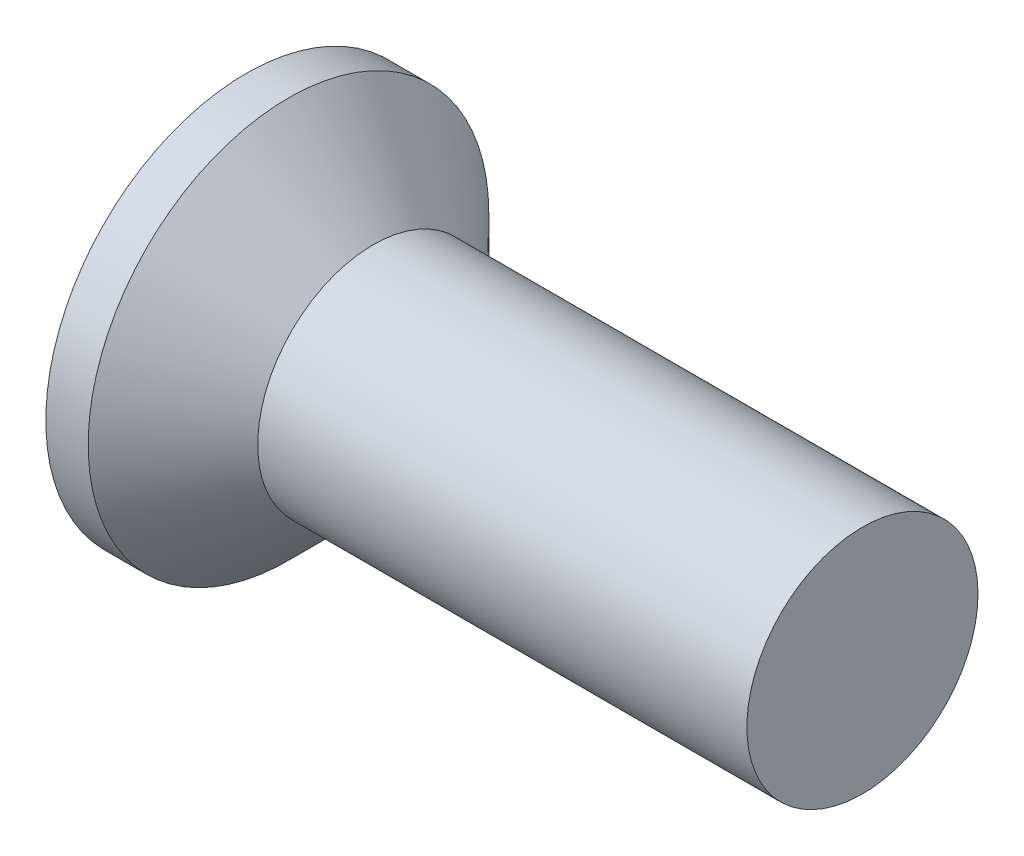
ISO-10303-21;
HEADER;
FILE_DESCRIPTION(('STEP AP214'),'2;1');
FILE_NAME('part.step','',(''),(''),'','','');
FILE_SCHEMA(('AUTOMOTIVE_DESIGN { 1 0 10303 214 1 1 1 1 }'));
ENDSEC;
DATA;
#1=APPLICATION_CONTEXT('core data for automotive mechanical design processes');
#2=APPLICATION_PROTOCOL_DEFINITION('international standard','automotive_design',2000,#1);
#3=PRODUCT_CONTEXT('',#1,'mechanical');
#4=PRODUCT('Part','Part','',(#3));
#5=PRODUCT_RELATED_PRODUCT_CATEGORY('part','',(#4));
#6=PRODUCT_DEFINITION_FORMATION('','',#4);
#7=PRODUCT_DEFINITION_CONTEXT('part definition',#1,'design');
#8=PRODUCT_DEFINITION('design','',#6,#7);
#9=PRODUCT_DEFINITION_SHAPE('','',#8);
#10=(LENGTH_UNIT() NAMED_UNIT(*) SI_UNIT(.MILLI.,.METRE.));
#11=(NAMED_UNIT(*) PLANE_ANGLE_UNIT() SI_UNIT($,.RADIAN.));
#12=(NAMED_UNIT(*) SI_UNIT($,.STERADIAN.) SOLID_ANGLE_UNIT());
#13=UNCERTAINTY_MEASURE_WITH_UNIT(LENGTH_MEASURE(1.E-05),#10,'distance_accuracy_value','');
#14=(GEOMETRIC_REPRESENTATION_CONTEXT(3) GLOBAL_UNCERTAINTY_ASSIGNED_CONTEXT((#13)) GLOBAL_UNIT_ASSIGNED_CONTEXT((#10,
#11,#12)) REPRESENTATION_CONTEXT('',''));
#15=CARTESIAN_POINT('',(0.,0.,0.));
#16=DIRECTION('',(0.,0.,1.));
#17=DIRECTION('',(1.,0.,0.));
#18=AXIS2_PLACEMENT_3D('',#15,#16,#17);
#19=CARTESIAN_POINT('',(0.,2.6,0.));
#20=DIRECTION('',(-1.,0.,0.));
#21=DIRECTION('',(0.,0.,1.));
#22=AXIS2_PLACEMENT_3D('',#19,#20,#21);
#23=PLANE('',#22);
#24=CARTESIAN_POINT('',(0.,0.,0.));
#25=DIRECTION('',(1.,0.,0.));
#26=DIRECTION('',(0.,0.,-1.));
#27=AXIS2_PLACEMENT_3D('',#24,#25,#26);
#28=CIRCLE('',#27,2.6);
#29=CARTESIAN_POINT('',(0.,0.,-2.6));
#30=VERTEX_POINT('',#29);
#31=EDGE_CURVE('E182',#30,#30,#28,.T.);
#32=ORIENTED_EDGE('',*,*,#31,.F.);
#33=EDGE_LOOP('',(#32));
#34=FACE_BOUND('',#33,.T.);
#35=DIRECTION('',(0.,1.,0.));
#36=VECTOR('',#35,1.);
#37=CARTESIAN_POINT('',(0.,-0.32,-0.32));
#38=LINE('',#37,#36);
#39=CARTESIAN_POINT('',(0.,-1.6,-0.32));
#40=VERTEX_POINT('',#39);
#41=CARTESIAN_POINT('',(0.,-0.62,-0.32));
#42=VERTEX_POINT('',#41);
#43=EDGE_CURVE('E308',#40,#42,#38,.T.);
#44=ORIENTED_EDGE('',*,*,#43,.T.);
#45=CARTESIAN_POINT('',(0.,-0.62,-0.62));
#46=DIRECTION('',(-1.,0.,0.));
#47=DIRECTION('',(0.,0.,1.));
#48=AXIS2_PLACEMENT_3D('',#45,#46,#47);
#49=CIRCLE('',#48,0.3);
#50=CARTESIAN_POINT('',(0.,-0.32,-0.62));
#51=VERTEX_POINT('',#50);
#52=EDGE_CURVE('E187',#42,#51,#49,.T.);
#53=ORIENTED_EDGE('',*,*,#52,.T.);
#54=DIRECTION('',(0.,0.,-1.));
#55=VECTOR('',#54,1.);
#56=CARTESIAN_POINT('',(0.,-0.32,-0.32));
#57=LINE('',#56,#55);
#58=CARTESIAN_POINT('',(0.,-0.32,-1.6));
#59=VERTEX_POINT('',#58);
#60=EDGE_CURVE('E310',#51,#59,#57,.T.);
#61=ORIENTED_EDGE('',*,*,#60,.T.);
#62=DIRECTION('',(0.,1.,0.));
#63=VECTOR('',#62,1.);
#64=CARTESIAN_POINT('',(0.,0.32,-1.6));
#65=LINE('',#64,#63);
#66=CARTESIAN_POINT('',(0.,0.32,-1.6));
#67=VERTEX_POINT('',#66);
#68=EDGE_CURVE('E312',#59,#67,#65,.T.);
#69=ORIENTED_EDGE('',*,*,#68,.T.);
#70=DIRECTION('',(0.,0.,1.));
#71=VECTOR('',#70,1.);
#72=CARTESIAN_POINT('',(0.,0.32,-0.32));
#73=LINE('',#72,#71);
#74=CARTESIAN_POINT('',(0.,0.32,-0.62));
#75=VERTEX_POINT('',#74);
#76=EDGE_CURVE('E315',#67,#75,#73,.T.);
#77=ORIENTED_EDGE('',*,*,#76,.T.);
#78=CARTESIAN_POINT('',(0.,0.62,-0.62));
#79=DIRECTION('',(-1.,0.,0.));
#80=DIRECTION('',(0.,0.,1.));
#81=AXIS2_PLACEMENT_3D('',#78,#79,#80);
#82=CIRCLE('',#81,0.3);
#83=CARTESIAN_POINT('',(0.,0.62,-0.32));
#84=VERTEX_POINT('',#83);
#85=EDGE_CURVE('E185',#75,#84,#82,.T.);
#86=ORIENTED_EDGE('',*,*,#85,.T.);
#87=DIRECTION('',(0.,1.,0.));
#88=VECTOR('',#87,1.);
#89=CARTESIAN_POINT('',(0.,0.32,-0.32));
#90=LINE('',#89,#88);
#91=CARTESIAN_POINT('',(0.,1.6,-0.32));
#92=VERTEX_POINT('',#91);
#93=EDGE_CURVE('E318',#84,#92,#90,.T.);
#94=ORIENTED_EDGE('',*,*,#93,.T.);
#95=DIRECTION('',(0.,0.,1.));
#96=VECTOR('',#95,1.);
#97=CARTESIAN_POINT('',(0.,1.6,-0.32));
#98=LINE('',#97,#96);
#99=CARTESIAN_POINT('',(0.,1.6,0.32));
#100=VERTEX_POINT('',#99);
#101=EDGE_CURVE('E320',#92,#100,#98,.T.);
#102=ORIENTED_EDGE('',*,*,#101,.T.);
#103=DIRECTION('',(0.,-1.,0.));
#104=VECTOR('',#103,1.);
#105=CARTESIAN_POINT('',(0.,0.32,0.32));
#106=LINE('',#105,#104);
#107=CARTESIAN_POINT('',(0.,0.62,0.32));
#108=VERTEX_POINT('',#107);
#109=EDGE_CURVE('E323',#100,#108,#106,.T.);
#110=ORIENTED_EDGE('',*,*,#109,.T.);
#111=CARTESIAN_POINT('',(0.,0.62,0.62));
#112=DIRECTION('',(-1.,0.,0.));
#113=DIRECTION('',(0.,0.,1.));
#114=AXIS2_PLACEMENT_3D('',#111,#112,#113);
#115=CIRCLE('',#114,0.3);
#116=CARTESIAN_POINT('',(0.,0.32,0.62));
#117=VERTEX_POINT('',#116);
#118=EDGE_CURVE('E150',#108,#117,#115,.T.);
#119=ORIENTED_EDGE('',*,*,#118,.T.);
#120=DIRECTION('',(0.,0.,1.));
#121=VECTOR('',#120,1.);
#122=CARTESIAN_POINT('',(0.,0.32,0.32));
#123=LINE('',#122,#121);
#124=CARTESIAN_POINT('',(0.,0.32,1.6));
#125=VERTEX_POINT('',#124);
#126=EDGE_CURVE('E144',#117,#125,#123,.T.);
#127=ORIENTED_EDGE('',*,*,#126,.T.);
#128=DIRECTION('',(0.,-1.,0.));
#129=VECTOR('',#128,1.);
#130=CARTESIAN_POINT('',(0.,0.32,1.6));
#131=LINE('',#130,#129);
#132=CARTESIAN_POINT('',(0.,-0.32,1.6));
#133=VERTEX_POINT('',#132);
#134=EDGE_CURVE('E148',#125,#133,#131,.T.);
#135=ORIENTED_EDGE('',*,*,#134,.T.);
#136=DIRECTION('',(0.,0.,-1.));
#137=VECTOR('',#136,1.);
#138=CARTESIAN_POINT('',(0.,-0.32,0.32));
#139=LINE('',#138,#137);
#140=CARTESIAN_POINT('',(0.,-0.32,0.62));
#141=VERTEX_POINT('',#140);
#142=EDGE_CURVE('E162',#133,#141,#139,.T.);
#143=ORIENTED_EDGE('',*,*,#142,.T.);
#144=CARTESIAN_POINT('',(0.,-0.62,0.62));
#145=DIRECTION('',(-1.,0.,0.));
#146=DIRECTION('',(0.,0.,1.));
#147=AXIS2_PLACEMENT_3D('',#144,#145,#146);
#148=CIRCLE('',#147,0.3);
#149=CARTESIAN_POINT('',(0.,-0.62,0.32));
#150=VERTEX_POINT('',#149);
#151=EDGE_CURVE('E181',#141,#150,#148,.T.);
#152=ORIENTED_EDGE('',*,*,#151,.T.);
#153=DIRECTION('',(0.,-1.,0.));
#154=VECTOR('',#153,1.);
#155=CARTESIAN_POINT('',(0.,-0.32,0.32));
#156=LINE('',#155,#154);
#157=CARTESIAN_POINT('',(0.,-1.6,0.319999999999999));
#158=VERTEX_POINT('',#157);
#159=EDGE_CURVE('E303',#150,#158,#156,.T.);
#160=ORIENTED_EDGE('',*,*,#159,.T.);
#161=DIRECTION('',(0.,0.,-1.));
#162=VECTOR('',#161,1.);
#163=CARTESIAN_POINT('',(0.,-1.6,-0.32));
#164=LINE('',#163,#162);
#165=EDGE_CURVE('E305',#158,#40,#164,.T.);
#166=ORIENTED_EDGE('',*,*,#165,.T.);
#167=EDGE_LOOP('',(#44,#53,#61,#69,#77,#86,#94,#102,#110,#119,#127,#135,#143,#152,#160,#166));
#168=FACE_BOUND('',#167,.T.);
#169=ADVANCED_FACE('F31',(#34,#168),#23,.T.);
#170=CARTESIAN_POINT('',(8.,1.5,0.));
#171=DIRECTION('',(1.,0.,0.));
#172=DIRECTION('',(0.,0.,-1.));
#173=AXIS2_PLACEMENT_3D('',#170,#171,#172);
#174=PLANE('',#173);
#175=CARTESIAN_POINT('',(8.,0.,0.));
#176=DIRECTION('',(1.,0.,0.));
#177=DIRECTION('',(0.,0.,-1.));
#178=AXIS2_PLACEMENT_3D('',#175,#176,#177);
#179=CIRCLE('',#178,1.5);
#180=CARTESIAN_POINT('',(8.,0.,-1.5));
#181=VERTEX_POINT('',#180);
#182=EDGE_CURVE('E168',#181,#181,#179,.T.);
#183=ORIENTED_EDGE('',*,*,#182,.T.);
#184=EDGE_LOOP('',(#183));
#185=FACE_BOUND('',#184,.T.);
#186=ADVANCED_FACE('F235',(#185),#174,.T.);
#187=CARTESIAN_POINT('',(4.51581291088132,0.,0.));
#188=DIRECTION('',(1.,0.,0.));
#189=DIRECTION('',(0.,0.,-1.));
#190=AXIS2_PLACEMENT_3D('',#187,#188,#189);
#191=CYLINDRICAL_SURFACE('',#190,2.6);
#192=ORIENTED_EDGE('',*,*,#31,.T.);
#193=EDGE_LOOP('',(#192));
#194=FACE_BOUND('',#193,.T.);
#195=CARTESIAN_POINT('',(0.550000000000004,0.,0.));
#196=DIRECTION('',(1.,0.,0.));
#197=DIRECTION('',(0.,0.,-1.));
#198=AXIS2_PLACEMENT_3D('',#195,#196,#197);
#199=CIRCLE('',#198,2.6);
#200=CARTESIAN_POINT('',(0.550000000000004,0.,-2.6));
#201=VERTEX_POINT('',#200);
#202=EDGE_CURVE('E327',#201,#201,#199,.T.);
#203=ORIENTED_EDGE('',*,*,#202,.F.);
#204=EDGE_LOOP('',(#203));
#205=FACE_BOUND('',#204,.T.);
#206=ADVANCED_FACE('F241',(#194,#205),#191,.T.);
#207=CARTESIAN_POINT('',(1.65,0.,0.));
#208=DIRECTION('',(-1.,0.,0.));
#209=DIRECTION('',(0.,0.,1.));
#210=AXIS2_PLACEMENT_3D('',#207,#208,#209);
#211=CONICAL_SURFACE('',#210,1.5,0.78539816339745);
#212=ORIENTED_EDGE('',*,*,#202,.T.);
#213=EDGE_LOOP('',(#212));
#214=FACE_BOUND('',#213,.T.);
#215=CARTESIAN_POINT('',(1.65,0.,0.));
#216=DIRECTION('',(1.,0.,0.));
#217=DIRECTION('',(0.,0.,-1.));
#218=AXIS2_PLACEMENT_3D('',#215,#216,#217);
#219=CIRCLE('',#218,1.5);
#220=CARTESIAN_POINT('',(1.65,0.,-1.5));
#221=VERTEX_POINT('',#220);
#222=EDGE_CURVE('E171',#221,#221,#219,.T.);
#223=ORIENTED_EDGE('',*,*,#222,.F.);
#224=EDGE_LOOP('',(#223));
#225=FACE_BOUND('',#224,.T.);
#226=ADVANCED_FACE('F363',(#214,#225),#211,.T.);
#227=CARTESIAN_POINT('',(4.51581291088132,0.,0.));
#228=DIRECTION('',(1.,0.,0.));
#229=DIRECTION('',(0.,0.,-1.));
#230=AXIS2_PLACEMENT_3D('',#227,#228,#229);
#231=CYLINDRICAL_SURFACE('',#230,1.5);
#232=ORIENTED_EDGE('',*,*,#222,.T.);
#233=EDGE_LOOP('',(#232));
#234=FACE_BOUND('',#233,.T.);
#235=ORIENTED_EDGE('',*,*,#182,.F.);
#236=EDGE_LOOP('',(#235));
#237=FACE_BOUND('',#236,.T.);
#238=ADVANCED_FACE('F361',(#234,#237),#231,.T.);
#239=CARTESIAN_POINT('',(0.825,0.32,0.32));
#240=DIRECTION('',(0.,-1.,0.));
#241=DIRECTION('',(0.,0.,-1.));
#242=AXIS2_PLACEMENT_3D('',#239,#240,#241);
#243=PLANE('',#242);
#244=ORIENTED_EDGE('',*,*,#126,.F.);
#245=DIRECTION('',(-1.,0.,0.));
#246=VECTOR('',#245,1.);
#247=CARTESIAN_POINT('',(0.825,0.32,0.62));
#248=LINE('',#247,#246);
#249=CARTESIAN_POINT('',(0.825,0.32,0.62));
#250=VERTEX_POINT('',#249);
#251=EDGE_CURVE('E199',#117,#250,#248,.F.);
#252=ORIENTED_EDGE('',*,*,#251,.T.);
#253=DIRECTION('',(0.,0.,1.));
#254=VECTOR('',#253,1.);
#255=CARTESIAN_POINT('',(0.825,0.32,0.32));
#256=LINE('',#255,#254);
#257=CARTESIAN_POINT('',(0.825,0.32,1.12368602791856));
#258=VERTEX_POINT('',#257);
#259=EDGE_CURVE('E166',#250,#258,#256,.T.);
#260=ORIENTED_EDGE('',*,*,#259,.T.);
#261=DIRECTION('',(-0.866025403784438,0.,0.500000000000001));
#262=VECTOR('',#261,1.);
#263=CARTESIAN_POINT('',(0.,0.32,1.6));
#264=LINE('',#263,#262);
#265=EDGE_CURVE('E158',#258,#125,#264,.T.);
#266=ORIENTED_EDGE('',*,*,#265,.T.);
#267=EDGE_LOOP('',(#244,#252,#260,#266));
#268=FACE_BOUND('',#267,.T.);
#269=ADVANCED_FACE('F164',(#268),#243,.T.);
#270=CARTESIAN_POINT('',(0.,0.32,1.6));
#271=DIRECTION('',(-0.500000000000001,0.,-0.866025403784438));
#272=DIRECTION('',(-0.866025403784438,0.,0.500000000000001));
#273=AXIS2_PLACEMENT_3D('',#270,#271,#272);
#274=PLANE('',#273);
#275=ORIENTED_EDGE('',*,*,#134,.F.);
#276=ORIENTED_EDGE('',*,*,#265,.F.);
#277=DIRECTION('',(0.,-1.,0.));
#278=VECTOR('',#277,1.);
#279=CARTESIAN_POINT('',(0.825,0.32,1.12368602791856));
#280=LINE('',#279,#278);
#281=CARTESIAN_POINT('',(0.825,-0.32,1.12368602791856));
#282=VERTEX_POINT('',#281);
#283=EDGE_CURVE('E177',#258,#282,#280,.T.);
#284=ORIENTED_EDGE('',*,*,#283,.T.);
#285=DIRECTION('',(-0.866025403784438,0.,0.500000000000001));
#286=VECTOR('',#285,1.);
#287=CARTESIAN_POINT('',(1.17300625842204,-0.32,0.922764520938917));
#288=LINE('',#287,#286);
#289=EDGE_CURVE('E160',#282,#133,#288,.T.);
#290=ORIENTED_EDGE('',*,*,#289,.T.);
#291=EDGE_LOOP('',(#275,#276,#284,#290));
#292=FACE_BOUND('',#291,.T.);
#293=ADVANCED_FACE('F157',(#292),#274,.T.);
#294=CARTESIAN_POINT('',(0.825,-0.32,0.32));
#295=DIRECTION('',(0.,1.,0.));
#296=DIRECTION('',(0.,0.,1.));
#297=AXIS2_PLACEMENT_3D('',#294,#295,#296);
#298=PLANE('',#297);
#299=DIRECTION('',(0.,0.,-1.));
#300=VECTOR('',#299,1.);
#301=CARTESIAN_POINT('',(0.825,-0.32,0.32));
#302=LINE('',#301,#300);
#303=CARTESIAN_POINT('',(0.825,-0.32,0.62));
#304=VERTEX_POINT('',#303);
#305=EDGE_CURVE('E349',#282,#304,#302,.T.);
#306=ORIENTED_EDGE('',*,*,#305,.T.);
#307=DIRECTION('',(-1.,0.,0.));
#308=VECTOR('',#307,1.);
#309=CARTESIAN_POINT('',(0.825,-0.32,0.62));
#310=LINE('',#309,#308);
#311=EDGE_CURVE('E201',#304,#141,#310,.T.);
#312=ORIENTED_EDGE('',*,*,#311,.T.);
#313=ORIENTED_EDGE('',*,*,#142,.F.);
#314=ORIENTED_EDGE('',*,*,#289,.F.);
#315=EDGE_LOOP('',(#306,#312,#313,#314));
#316=FACE_BOUND('',#315,.T.);
#317=ADVANCED_FACE('F255',(#316),#298,.T.);
#318=CARTESIAN_POINT('',(0.825,-0.32,0.32));
#319=DIRECTION('',(0.,0.,-1.));
#320=DIRECTION('',(0.,1.,0.));
#321=AXIS2_PLACEMENT_3D('',#318,#319,#320);
#322=PLANE('',#321);
#323=ORIENTED_EDGE('',*,*,#159,.F.);
#324=DIRECTION('',(-1.,0.,0.));
#325=VECTOR('',#324,1.);
#326=CARTESIAN_POINT('',(0.825,-0.62,0.32));
#327=LINE('',#326,#325);
#328=CARTESIAN_POINT('',(0.825,-0.62,0.32));
#329=VERTEX_POINT('',#328);
#330=EDGE_CURVE('E46',#150,#329,#327,.F.);
#331=ORIENTED_EDGE('',*,*,#330,.T.);
#332=DIRECTION('',(0.,-1.,0.));
#333=VECTOR('',#332,1.);
#334=CARTESIAN_POINT('',(0.825,-0.32,0.32));
#335=LINE('',#334,#333);
#336=CARTESIAN_POINT('',(0.825,-1.12368602791856,0.32));
#337=VERTEX_POINT('',#336);
#338=EDGE_CURVE('E292',#329,#337,#335,.T.);
#339=ORIENTED_EDGE('',*,*,#338,.T.);
#340=DIRECTION('',(-0.866025403784438,-0.500000000000001,0.));
#341=VECTOR('',#340,1.);
#342=CARTESIAN_POINT('',(0.,-1.6,0.319999999999999));
#343=LINE('',#342,#341);
#344=EDGE_CURVE('E173',#337,#158,#343,.T.);
#345=ORIENTED_EDGE('',*,*,#344,.T.);
#346=EDGE_LOOP('',(#323,#331,#339,#345));
#347=FACE_BOUND('',#346,.T.);
#348=ADVANCED_FACE('F260',(#347),#322,.T.);
#349=CARTESIAN_POINT('',(0.,-1.6,-0.32));
#350=DIRECTION('',(-0.500000000000001,0.866025403784438,0.));
#351=DIRECTION('',(-0.866025403784438,-0.500000000000001,0.));
#352=AXIS2_PLACEMENT_3D('',#349,#350,#351);
#353=PLANE('',#352);
#354=ORIENTED_EDGE('',*,*,#165,.F.);
#355=ORIENTED_EDGE('',*,*,#344,.F.);
#356=DIRECTION('',(0.,0.,-1.));
#357=VECTOR('',#356,1.);
#358=CARTESIAN_POINT('',(0.825,-1.12368602791856,-0.32));
#359=LINE('',#358,#357);
#360=CARTESIAN_POINT('',(0.825,-1.12368602791856,-0.32));
#361=VERTEX_POINT('',#360);
#362=EDGE_CURVE('E288',#337,#361,#359,.T.);
#363=ORIENTED_EDGE('',*,*,#362,.T.);
#364=DIRECTION('',(-0.866025403784438,-0.500000000000001,0.));
#365=VECTOR('',#364,1.);
#366=CARTESIAN_POINT('',(1.17300625842204,-0.922764520938917,-0.32));
#367=LINE('',#366,#365);
#368=EDGE_CURVE('E287',#361,#40,#367,.T.);
#369=ORIENTED_EDGE('',*,*,#368,.T.);
#370=EDGE_LOOP('',(#354,#355,#363,#369));
#371=FACE_BOUND('',#370,.T.);
#372=ADVANCED_FACE('F256',(#371),#353,.T.);
#373=CARTESIAN_POINT('',(0.825,-0.32,-0.32));
#374=DIRECTION('',(0.,0.,1.));
#375=DIRECTION('',(1.,0.,0.));
#376=AXIS2_PLACEMENT_3D('',#373,#374,#375);
#377=PLANE('',#376);
#378=DIRECTION('',(0.,1.,0.));
#379=VECTOR('',#378,1.);
#380=CARTESIAN_POINT('',(0.825,-0.32,-0.32));
#381=LINE('',#380,#379);
#382=CARTESIAN_POINT('',(0.825,-0.62,-0.32));
#383=VERTEX_POINT('',#382);
#384=EDGE_CURVE('E281',#361,#383,#381,.T.);
#385=ORIENTED_EDGE('',*,*,#384,.T.);
#386=DIRECTION('',(-1.,0.,0.));
#387=VECTOR('',#386,1.);
#388=CARTESIAN_POINT('',(0.825,-0.62,-0.32));
#389=LINE('',#388,#387);
#390=EDGE_CURVE('E178',#383,#42,#389,.T.);
#391=ORIENTED_EDGE('',*,*,#390,.T.);
#392=ORIENTED_EDGE('',*,*,#43,.F.);
#393=ORIENTED_EDGE('',*,*,#368,.F.);
#394=EDGE_LOOP('',(#385,#391,#392,#393));
#395=FACE_BOUND('',#394,.T.);
#396=ADVANCED_FACE('F259',(#395),#377,.T.);
#397=CARTESIAN_POINT('',(0.825,-0.32,-0.32));
#398=DIRECTION('',(0.,1.,0.));
#399=DIRECTION('',(0.,0.,1.));
#400=AXIS2_PLACEMENT_3D('',#397,#398,#399);
#401=PLANE('',#400);
#402=ORIENTED_EDGE('',*,*,#60,.F.);
#403=DIRECTION('',(-1.,0.,0.));
#404=VECTOR('',#403,1.);
#405=CARTESIAN_POINT('',(0.825,-0.32,-0.62));
#406=LINE('',#405,#404);
#407=CARTESIAN_POINT('',(0.825,-0.32,-0.62));
#408=VERTEX_POINT('',#407);
#409=EDGE_CURVE('E189',#51,#408,#406,.F.);
#410=ORIENTED_EDGE('',*,*,#409,.T.);
#411=DIRECTION('',(0.,0.,-1.));
#412=VECTOR('',#411,1.);
#413=CARTESIAN_POINT('',(0.825,-0.32,-0.32));
#414=LINE('',#413,#412);
#415=CARTESIAN_POINT('',(0.825,-0.32,-1.12368602791856));
#416=VERTEX_POINT('',#415);
#417=EDGE_CURVE('E283',#408,#416,#414,.T.);
#418=ORIENTED_EDGE('',*,*,#417,.T.);
#419=DIRECTION('',(-0.866025403784438,0.,-0.500000000000001));
#420=VECTOR('',#419,1.);
#421=CARTESIAN_POINT('',(0.,-0.32,-1.6));
#422=LINE('',#421,#420);
#423=EDGE_CURVE('E339',#416,#59,#422,.T.);
#424=ORIENTED_EDGE('',*,*,#423,.T.);
#425=EDGE_LOOP('',(#402,#410,#418,#424));
#426=FACE_BOUND('',#425,.T.);
#427=ADVANCED_FACE('F266',(#426),#401,.T.);
#428=CARTESIAN_POINT('',(0.,0.32,-1.6));
#429=DIRECTION('',(-0.500000000000001,0.,0.866025403784438));
#430=DIRECTION('',(0.866025403784438,0.,0.500000000000001));
#431=AXIS2_PLACEMENT_3D('',#428,#429,#430);
#432=PLANE('',#431);
#433=ORIENTED_EDGE('',*,*,#68,.F.);
#434=ORIENTED_EDGE('',*,*,#423,.F.);
#435=DIRECTION('',(0.,1.,0.));
#436=VECTOR('',#435,1.);
#437=CARTESIAN_POINT('',(0.825,0.32,-1.12368602791856));
#438=LINE('',#437,#436);
#439=CARTESIAN_POINT('',(0.825,0.32,-1.12368602791856));
#440=VERTEX_POINT('',#439);
#441=EDGE_CURVE('E290',#416,#440,#438,.T.);
#442=ORIENTED_EDGE('',*,*,#441,.T.);
#443=DIRECTION('',(-0.866025403784438,0.,-0.500000000000001));
#444=VECTOR('',#443,1.);
#445=CARTESIAN_POINT('',(1.17300625842204,0.32,-0.922764520938918));
#446=LINE('',#445,#444);
#447=EDGE_CURVE('E337',#440,#67,#446,.T.);
#448=ORIENTED_EDGE('',*,*,#447,.T.);
#449=EDGE_LOOP('',(#433,#434,#442,#448));
#450=FACE_BOUND('',#449,.T.);
#451=ADVANCED_FACE('F262',(#450),#432,.T.);
#452=CARTESIAN_POINT('',(0.825,0.32,-0.32));
#453=DIRECTION('',(0.,-1.,0.));
#454=DIRECTION('',(0.,0.,-1.));
#455=AXIS2_PLACEMENT_3D('',#452,#453,#454);
#456=PLANE('',#455);
#457=DIRECTION('',(0.,0.,1.));
#458=VECTOR('',#457,1.);
#459=CARTESIAN_POINT('',(0.825,0.32,-0.32));
#460=LINE('',#459,#458);
#461=CARTESIAN_POINT('',(0.825,0.32,-0.62));
#462=VERTEX_POINT('',#461);
#463=EDGE_CURVE('E297',#440,#462,#460,.T.);
#464=ORIENTED_EDGE('',*,*,#463,.T.);
#465=DIRECTION('',(-1.,0.,0.));
#466=VECTOR('',#465,1.);
#467=CARTESIAN_POINT('',(0.825,0.32,-0.62));
#468=LINE('',#467,#466);
#469=EDGE_CURVE('E191',#462,#75,#468,.T.);
#470=ORIENTED_EDGE('',*,*,#469,.T.);
#471=ORIENTED_EDGE('',*,*,#76,.F.);
#472=ORIENTED_EDGE('',*,*,#447,.F.);
#473=EDGE_LOOP('',(#464,#470,#471,#472));
#474=FACE_BOUND('',#473,.T.);
#475=ADVANCED_FACE('F265',(#474),#456,.T.);
#476=CARTESIAN_POINT('',(0.825,0.32,-0.32));
#477=DIRECTION('',(0.,0.,1.));
#478=DIRECTION('',(1.,0.,0.));
#479=AXIS2_PLACEMENT_3D('',#476,#477,#478);
#480=PLANE('',#479);
#481=ORIENTED_EDGE('',*,*,#93,.F.);
#482=DIRECTION('',(-1.,0.,0.));
#483=VECTOR('',#482,1.);
#484=CARTESIAN_POINT('',(0.825,0.62,-0.32));
#485=LINE('',#484,#483);
#486=CARTESIAN_POINT('',(0.825,0.62,-0.32));
#487=VERTEX_POINT('',#486);
#488=EDGE_CURVE('E194',#84,#487,#485,.F.);
#489=ORIENTED_EDGE('',*,*,#488,.T.);
#490=DIRECTION('',(0.,1.,0.));
#491=VECTOR('',#490,1.);
#492=CARTESIAN_POINT('',(0.825,0.32,-0.32));
#493=LINE('',#492,#491);
#494=CARTESIAN_POINT('',(0.825,1.12368602791856,-0.32));
#495=VERTEX_POINT('',#494);
#496=EDGE_CURVE('E300',#487,#495,#493,.T.);
#497=ORIENTED_EDGE('',*,*,#496,.T.);
#498=DIRECTION('',(-0.866025403784438,0.500000000000001,0.));
#499=VECTOR('',#498,1.);
#500=CARTESIAN_POINT('',(0.,1.6,-0.32));
#501=LINE('',#500,#499);
#502=EDGE_CURVE('E333',#495,#92,#501,.T.);
#503=ORIENTED_EDGE('',*,*,#502,.T.);
#504=EDGE_LOOP('',(#481,#489,#497,#503));
#505=FACE_BOUND('',#504,.T.);
#506=ADVANCED_FACE('F251',(#505),#480,.T.);
#507=CARTESIAN_POINT('',(0.,1.6,-0.32));
#508=DIRECTION('',(-0.500000000000001,-0.866025403784438,0.));
#509=DIRECTION('',(0.866025403784438,-0.500000000000001,0.));
#510=AXIS2_PLACEMENT_3D('',#507,#508,#509);
#511=PLANE('',#510);
#512=ORIENTED_EDGE('',*,*,#101,.F.);
#513=ORIENTED_EDGE('',*,*,#502,.F.);
#514=DIRECTION('',(0.,0.,1.));
#515=VECTOR('',#514,1.);
#516=CARTESIAN_POINT('',(0.825,1.12368602791856,-0.32));
#517=LINE('',#516,#515);
#518=CARTESIAN_POINT('',(0.825,1.12368602791856,0.32));
#519=VERTEX_POINT('',#518);
#520=EDGE_CURVE('E221',#495,#519,#517,.T.);
#521=ORIENTED_EDGE('',*,*,#520,.T.);
#522=DIRECTION('',(-0.866025403784438,0.500000000000001,0.));
#523=VECTOR('',#522,1.);
#524=CARTESIAN_POINT('',(1.17300625842204,0.922764520938917,0.32));
#525=LINE('',#524,#523);
#526=EDGE_CURVE('E220',#519,#100,#525,.T.);
#527=ORIENTED_EDGE('',*,*,#526,.T.);
#528=EDGE_LOOP('',(#512,#513,#521,#527));
#529=FACE_BOUND('',#528,.T.);
#530=ADVANCED_FACE('F248',(#529),#511,.T.);
#531=CARTESIAN_POINT('',(0.825,0.32,0.32));
#532=DIRECTION('',(0.,0.,-1.));
#533=DIRECTION('',(0.,1.,0.));
#534=AXIS2_PLACEMENT_3D('',#531,#532,#533);
#535=PLANE('',#534);
#536=DIRECTION('',(0.,-1.,0.));
#537=VECTOR('',#536,1.);
#538=CARTESIAN_POINT('',(0.825,0.32,0.32));
#539=LINE('',#538,#537);
#540=CARTESIAN_POINT('',(0.825,0.62,0.32));
#541=VERTEX_POINT('',#540);
#542=EDGE_CURVE('E213',#519,#541,#539,.T.);
#543=ORIENTED_EDGE('',*,*,#542,.T.);
#544=DIRECTION('',(-1.,0.,0.));
#545=VECTOR('',#544,1.);
#546=CARTESIAN_POINT('',(0.825,0.62,0.32));
#547=LINE('',#546,#545);
#548=EDGE_CURVE('E196',#541,#108,#547,.T.);
#549=ORIENTED_EDGE('',*,*,#548,.T.);
#550=ORIENTED_EDGE('',*,*,#109,.F.);
#551=ORIENTED_EDGE('',*,*,#526,.F.);
#552=EDGE_LOOP('',(#543,#549,#550,#551));
#553=FACE_BOUND('',#552,.T.);
#554=ADVANCED_FACE('F218',(#553),#535,.T.);
#555=CARTESIAN_POINT('',(0.825,0.32,0.32));
#556=DIRECTION('',(1.,0.,0.));
#557=DIRECTION('',(0.,0.,-1.));
#558=AXIS2_PLACEMENT_3D('',#555,#556,#557);
#559=PLANE('',#558);
#560=ORIENTED_EDGE('',*,*,#259,.F.);
#561=CARTESIAN_POINT('',(0.825,0.62,0.62));
#562=DIRECTION('',(1.,0.,0.));
#563=DIRECTION('',(0.,0.,-1.));
#564=AXIS2_PLACEMENT_3D('',#561,#562,#563);
#565=CIRCLE('',#564,0.3);
#566=EDGE_CURVE('E39',#250,#541,#565,.T.);
#567=ORIENTED_EDGE('',*,*,#566,.T.);
#568=ORIENTED_EDGE('',*,*,#542,.F.);
#569=ORIENTED_EDGE('',*,*,#520,.F.);
#570=ORIENTED_EDGE('',*,*,#496,.F.);
#571=CARTESIAN_POINT('',(0.825,0.62,-0.62));
#572=DIRECTION('',(1.,0.,0.));
#573=DIRECTION('',(0.,0.,-1.));
#574=AXIS2_PLACEMENT_3D('',#571,#572,#573);
#575=CIRCLE('',#574,0.3);
#576=EDGE_CURVE('E207',#487,#462,#575,.T.);
#577=ORIENTED_EDGE('',*,*,#576,.T.);
#578=ORIENTED_EDGE('',*,*,#463,.F.);
#579=ORIENTED_EDGE('',*,*,#441,.F.);
#580=ORIENTED_EDGE('',*,*,#417,.F.);
#581=CARTESIAN_POINT('',(0.825,-0.62,-0.62));
#582=DIRECTION('',(1.,0.,0.));
#583=DIRECTION('',(0.,0.,-1.));
#584=AXIS2_PLACEMENT_3D('',#581,#582,#583);
#585=CIRCLE('',#584,0.3);
#586=EDGE_CURVE('E205',#408,#383,#585,.T.);
#587=ORIENTED_EDGE('',*,*,#586,.T.);
#588=ORIENTED_EDGE('',*,*,#384,.F.);
#589=ORIENTED_EDGE('',*,*,#362,.F.);
#590=ORIENTED_EDGE('',*,*,#338,.F.);
#591=CARTESIAN_POINT('',(0.825,-0.62,0.62));
#592=DIRECTION('',(1.,0.,0.));
#593=DIRECTION('',(0.,0.,-1.));
#594=AXIS2_PLACEMENT_3D('',#591,#592,#593);
#595=CIRCLE('',#594,0.3);
#596=EDGE_CURVE('E11',#329,#304,#595,.T.);
#597=ORIENTED_EDGE('',*,*,#596,.T.);
#598=ORIENTED_EDGE('',*,*,#305,.F.);
#599=ORIENTED_EDGE('',*,*,#283,.F.);
#600=EDGE_LOOP('',(#560,#567,#568,#569,#570,#577,#578,#579,#580,#587,#588,#589,#590,#597,#598,#599));
#601=FACE_BOUND('',#600,.T.);
#602=ADVANCED_FACE('F211',(#601),#559,.F.);
#603=CARTESIAN_POINT('',(0.825,-0.62,-0.62));
#604=DIRECTION('',(-1.,0.,0.));
#605=DIRECTION('',(0.,0.,1.));
#606=AXIS2_PLACEMENT_3D('',#603,#604,#605);
#607=CYLINDRICAL_SURFACE('',#606,0.3);
#608=ORIENTED_EDGE('',*,*,#586,.F.);
#609=ORIENTED_EDGE('',*,*,#409,.F.);
#610=ORIENTED_EDGE('',*,*,#52,.F.);
#611=ORIENTED_EDGE('',*,*,#390,.F.);
#612=EDGE_LOOP('',(#608,#609,#610,#611));
#613=FACE_BOUND('',#612,.T.);
#614=ADVANCED_FACE('F231',(#613),#607,.T.);
#615=CARTESIAN_POINT('',(0.825,0.62,-0.62));
#616=DIRECTION('',(-1.,0.,0.));
#617=DIRECTION('',(0.,0.,1.));
#618=AXIS2_PLACEMENT_3D('',#615,#616,#617);
#619=CYLINDRICAL_SURFACE('',#618,0.3);
#620=ORIENTED_EDGE('',*,*,#576,.F.);
#621=ORIENTED_EDGE('',*,*,#488,.F.);
#622=ORIENTED_EDGE('',*,*,#85,.F.);
#623=ORIENTED_EDGE('',*,*,#469,.F.);
#624=EDGE_LOOP('',(#620,#621,#622,#623));
#625=FACE_BOUND('',#624,.T.);
#626=ADVANCED_FACE('F225',(#625),#619,.T.);
#627=CARTESIAN_POINT('',(0.825,0.62,0.62));
#628=DIRECTION('',(-1.,0.,0.));
#629=DIRECTION('',(0.,0.,1.));
#630=AXIS2_PLACEMENT_3D('',#627,#628,#629);
#631=CYLINDRICAL_SURFACE('',#630,0.3);
#632=ORIENTED_EDGE('',*,*,#566,.F.);
#633=ORIENTED_EDGE('',*,*,#251,.F.);
#634=ORIENTED_EDGE('',*,*,#118,.F.);
#635=ORIENTED_EDGE('',*,*,#548,.F.);
#636=EDGE_LOOP('',(#632,#633,#634,#635));
#637=FACE_BOUND('',#636,.T.);
#638=ADVANCED_FACE('F223',(#637),#631,.T.);
#639=CARTESIAN_POINT('',(0.825,-0.62,0.62));
#640=DIRECTION('',(-1.,0.,0.));
#641=DIRECTION('',(0.,0.,1.));
#642=AXIS2_PLACEMENT_3D('',#639,#640,#641);
#643=CYLINDRICAL_SURFACE('',#642,0.3);
#644=ORIENTED_EDGE('',*,*,#596,.F.);
#645=ORIENTED_EDGE('',*,*,#330,.F.);
#646=ORIENTED_EDGE('',*,*,#151,.F.);
#647=ORIENTED_EDGE('',*,*,#311,.F.);
#648=EDGE_LOOP('',(#644,#645,#646,#647));
#649=FACE_BOUND('',#648,.T.);
#650=ADVANCED_FACE('F33',(#649),#643,.T.);
#651=CLOSED_SHELL('',(#169,#186,#206,#226,#238,#269,#293,#317,#348,#372,#396,#427,#451,#475,
#506,#530,#554,#602,#614,#626,#638,#650));
#652=MANIFOLD_SOLID_BREP('B2',#651);
#653=ADVANCED_BREP_SHAPE_REPRESENTATION('',(#18,#652),#14);
#654=SHAPE_DEFINITION_REPRESENTATION(#9,#653);
ENDSEC;
END-ISO-10303-21;
